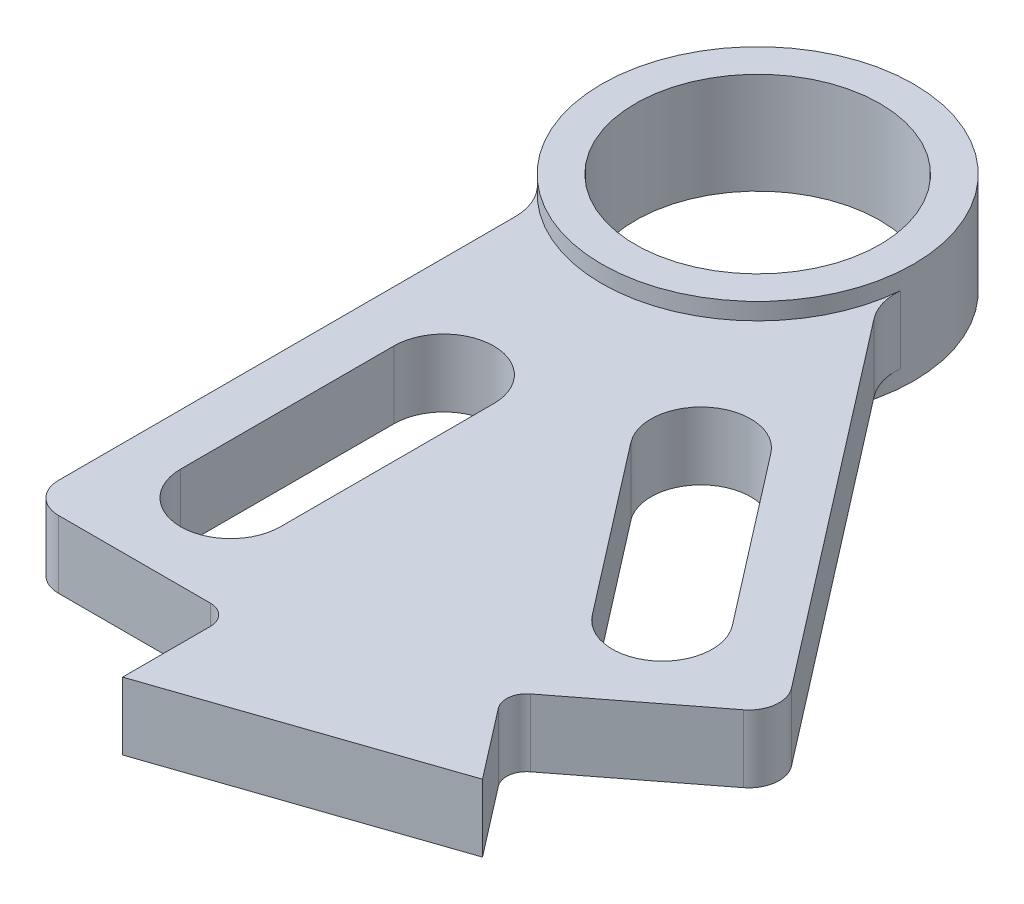
ISO-10303-21;
HEADER;
FILE_DESCRIPTION(('STEP AP214'),'2;1');
FILE_NAME('part.step','',(''),(''),'','','');
FILE_SCHEMA(('AUTOMOTIVE_DESIGN { 1 0 10303 214 1 1 1 1 }'));
ENDSEC;
DATA;
#1=APPLICATION_CONTEXT('core data for automotive mechanical design processes');
#2=APPLICATION_PROTOCOL_DEFINITION('international standard','automotive_design',2000,#1);
#3=PRODUCT_CONTEXT('',#1,'mechanical');
#4=PRODUCT('Part','Part','',(#3));
#5=PRODUCT_RELATED_PRODUCT_CATEGORY('part','',(#4));
#6=PRODUCT_DEFINITION_FORMATION('','',#4);
#7=PRODUCT_DEFINITION_CONTEXT('part definition',#1,'design');
#8=PRODUCT_DEFINITION('design','',#6,#7);
#9=PRODUCT_DEFINITION_SHAPE('','',#8);
#10=(LENGTH_UNIT() NAMED_UNIT(*) SI_UNIT(.MILLI.,.METRE.));
#11=(NAMED_UNIT(*) PLANE_ANGLE_UNIT() SI_UNIT($,.RADIAN.));
#12=(NAMED_UNIT(*) SI_UNIT($,.STERADIAN.) SOLID_ANGLE_UNIT());
#13=UNCERTAINTY_MEASURE_WITH_UNIT(LENGTH_MEASURE(1.E-05),#10,'distance_accuracy_value','');
#14=(GEOMETRIC_REPRESENTATION_CONTEXT(3) GLOBAL_UNCERTAINTY_ASSIGNED_CONTEXT((#13)) GLOBAL_UNIT_ASSIGNED_CONTEXT((#10,
#11,#12)) REPRESENTATION_CONTEXT('',''));
#15=CARTESIAN_POINT('',(0.,0.,0.));
#16=DIRECTION('',(0.,0.,1.));
#17=DIRECTION('',(1.,0.,0.));
#18=AXIS2_PLACEMENT_3D('',#15,#16,#17);
#19=CARTESIAN_POINT('',(0.,4.7625,0.));
#20=DIRECTION('',(0.,-1.,0.));
#21=DIRECTION('',(0.,0.,-1.));
#22=AXIS2_PLACEMENT_3D('',#19,#20,#21);
#23=CYLINDRICAL_SURFACE('',#22,11.5062);
#24=CARTESIAN_POINT('',(0.,4.7625,0.));
#25=DIRECTION('',(0.,1.,0.));
#26=DIRECTION('',(0.,0.,1.));
#27=AXIS2_PLACEMENT_3D('',#24,#25,#26);
#28=CIRCLE('',#27,11.5062);
#29=CARTESIAN_POINT('',(0.,4.7625,-11.5062));
#30=VERTEX_POINT('',#29);
#31=EDGE_CURVE('E309',#30,#30,#28,.T.);
#32=CARTESIAN_POINT('',(0.,-4.7625,0.));
#33=DIRECTION('',(0.,1.,0.));
#34=DIRECTION('',(0.,0.,1.));
#35=AXIS2_PLACEMENT_3D('',#32,#33,#34);
#36=CIRCLE('',#35,11.5062);
#37=CARTESIAN_POINT('',(0.,-4.7625,-11.5062));
#38=VERTEX_POINT('',#37);
#39=EDGE_CURVE('E300',#38,#38,#36,.T.);
#40=CARTESIAN_POINT('',(0.,4.7625,-11.5062));
#41=CARTESIAN_POINT('',(0.,4.66328125,-11.5062));
#42=CARTESIAN_POINT('',(0.,4.5640625,-11.5062));
#43=CARTESIAN_POINT('',(0.,4.365625,-11.5062));
#44=CARTESIAN_POINT('',(0.,4.26640625,-11.5062));
#45=CARTESIAN_POINT('',(0.,4.06796875,-11.5062));
#46=CARTESIAN_POINT('',(0.,3.96875,-11.5062));
#47=CARTESIAN_POINT('',(0.,3.7703125,-11.5062));
#48=CARTESIAN_POINT('',(0.,3.67109375,-11.5062));
#49=CARTESIAN_POINT('',(0.,3.47265625,-11.5062));
#50=CARTESIAN_POINT('',(0.,3.3734375,-11.5062));
#51=CARTESIAN_POINT('',(0.,3.175,-11.5062));
#52=CARTESIAN_POINT('',(0.,3.07578125,-11.5062));
#53=CARTESIAN_POINT('',(0.,2.87734375,-11.5062));
#54=CARTESIAN_POINT('',(0.,2.778125,-11.5062));
#55=CARTESIAN_POINT('',(0.,2.5796875,-11.5062));
#56=CARTESIAN_POINT('',(0.,2.48046875,-11.5062));
#57=CARTESIAN_POINT('',(0.,2.28203125,-11.5062));
#58=CARTESIAN_POINT('',(0.,2.1828125,-11.5062));
#59=CARTESIAN_POINT('',(0.,1.984375,-11.5062));
#60=CARTESIAN_POINT('',(0.,1.88515625,-11.5062));
#61=CARTESIAN_POINT('',(0.,1.68671875,-11.5062));
#62=CARTESIAN_POINT('',(0.,1.5875,-11.5062));
#63=CARTESIAN_POINT('',(0.,1.3890625,-11.5062));
#64=CARTESIAN_POINT('',(0.,1.28984375,-11.5062));
#65=CARTESIAN_POINT('',(0.,1.09140625,-11.5062));
#66=CARTESIAN_POINT('',(0.,0.992187499999999,-11.5062));
#67=CARTESIAN_POINT('',(0.,0.79375,-11.5062));
#68=CARTESIAN_POINT('',(0.,0.69453125,-11.5062));
#69=CARTESIAN_POINT('',(0.,0.49609375,-11.5062));
#70=CARTESIAN_POINT('',(0.,0.396875,-11.5062));
#71=CARTESIAN_POINT('',(0.,0.1984375,-11.5062));
#72=CARTESIAN_POINT('',(0.,0.0992187500000001,-11.5062));
#73=CARTESIAN_POINT('',(0.,-0.0992187500000001,-11.5062));
#74=CARTESIAN_POINT('',(0.,-0.1984375,-11.5062));
#75=CARTESIAN_POINT('',(0.,-0.396875,-11.5062));
#76=CARTESIAN_POINT('',(0.,-0.49609375,-11.5062));
#77=CARTESIAN_POINT('',(0.,-0.69453125,-11.5062));
#78=CARTESIAN_POINT('',(0.,-0.793750000000001,-11.5062));
#79=CARTESIAN_POINT('',(0.,-0.992187500000001,-11.5062));
#80=CARTESIAN_POINT('',(0.,-1.09140625,-11.5062));
#81=CARTESIAN_POINT('',(0.,-1.28984375,-11.5062));
#82=CARTESIAN_POINT('',(0.,-1.3890625,-11.5062));
#83=CARTESIAN_POINT('',(0.,-1.5875,-11.5062));
#84=CARTESIAN_POINT('',(0.,-1.68671875,-11.5062));
#85=CARTESIAN_POINT('',(0.,-1.88515625,-11.5062));
#86=CARTESIAN_POINT('',(0.,-1.984375,-11.5062));
#87=CARTESIAN_POINT('',(0.,-2.1828125,-11.5062));
#88=CARTESIAN_POINT('',(0.,-2.28203125,-11.5062));
#89=CARTESIAN_POINT('',(0.,-2.48046875,-11.5062));
#90=CARTESIAN_POINT('',(0.,-2.5796875,-11.5062));
#91=CARTESIAN_POINT('',(0.,-2.778125,-11.5062));
#92=CARTESIAN_POINT('',(0.,-2.87734375,-11.5062));
#93=CARTESIAN_POINT('',(0.,-3.07578125,-11.5062));
#94=CARTESIAN_POINT('',(0.,-3.175,-11.5062));
#95=CARTESIAN_POINT('',(0.,-3.3734375,-11.5062));
#96=CARTESIAN_POINT('',(0.,-3.47265625,-11.5062));
#97=CARTESIAN_POINT('',(0.,-3.67109375,-11.5062));
#98=CARTESIAN_POINT('',(0.,-3.7703125,-11.5062));
#99=CARTESIAN_POINT('',(0.,-3.96875,-11.5062));
#100=CARTESIAN_POINT('',(0.,-4.06796875,-11.5062));
#101=CARTESIAN_POINT('',(0.,-4.26640625,-11.5062));
#102=CARTESIAN_POINT('',(0.,-4.365625,-11.5062));
#103=CARTESIAN_POINT('',(0.,-4.5640625,-11.5062));
#104=CARTESIAN_POINT('',(0.,-4.66328125,-11.5062));
#105=CARTESIAN_POINT('',(0.,-4.7625,-11.5062));
#106=B_SPLINE_CURVE_WITH_KNOTS('',3,(#40,#41,#42,#43,#44,#45,#46,#47,#48,#49,#50,#51,#52,#53,
#54,#55,#56,#57,#58,#59,#60,#61,#62,#63,#64,#65,#66,#67,#68,#69,#70,#71,#72,#73,#74,#75,#76,#77,
#78,#79,#80,#81,#82,#83,#84,#85,#86,#87,#88,#89,#90,#91,#92,#93,#94,#95,#96,#97,#98,#99,#100,
#101,#102,#103,#104,#105),.UNSPECIFIED.,.F.,.F.,(4,2,2,2,2,2,2,2,2,2,2,2,2,2,2,2,2,2,2,2,2,2,2,
2,2,2,2,2,2,2,2,2,4),(0.,0.29765625,0.5953125,0.892968750000001,1.190625,1.48828125,1.7859375,
2.08359375,2.38125,2.67890625,2.9765625,3.27421875,3.571875,3.86953125,4.1671875,4.46484375,
4.7625,5.06015625,5.3578125,5.65546875,5.953125,6.25078125,6.5484375,6.84609375,7.14375,
7.44140625,7.7390625,8.03671875,8.334375,8.63203125,8.9296875,9.22734375,9.525),.UNSPECIFIED.);
#107=EDGE_CURVE('BSEAM45',#30,#38,#106,.T.);
#108=ORIENTED_EDGE('',*,*,#31,.T.);
#109=ORIENTED_EDGE('',*,*,#39,.F.);
#110=ORIENTED_EDGE('',*,*,#107,.T.);
#111=ORIENTED_EDGE('',*,*,#107,.F.);
#112=EDGE_LOOP('',(#108,#110,#109,#111));
#113=FACE_BOUND('',#112,.T.);
#114=ADVANCED_FACE('F45',(#113),#23,.F.);
#115=CARTESIAN_POINT('',(0.,4.7625,0.));
#116=DIRECTION('',(0.,-1.,0.));
#117=DIRECTION('',(0.,0.,-1.));
#118=AXIS2_PLACEMENT_3D('',#115,#116,#117);
#119=CYLINDRICAL_SURFACE('',#118,14.6812);
#120=DIRECTION('',(0.,-1.,0.));
#121=VECTOR('',#120,1.);
#122=CARTESIAN_POINT('',(14.6318760665032,4.7625,1.20242929708544));
#123=LINE('',#122,#121);
#124=CARTESIAN_POINT('',(14.6318760665032,3.175,1.20242929708544));
#125=VERTEX_POINT('',#124);
#126=CARTESIAN_POINT('',(14.6318760665032,-3.175,1.20242929708544));
#127=VERTEX_POINT('',#126);
#128=EDGE_CURVE('E323',#125,#127,#123,.T.);
#129=ORIENTED_EDGE('',*,*,#128,.T.);
#130=CARTESIAN_POINT('',(0.,-3.175,0.));
#131=DIRECTION('',(0.,1.,0.));
#132=DIRECTION('',(0.,0.,1.));
#133=AXIS2_PLACEMENT_3D('',#130,#131,#132);
#134=CIRCLE('',#133,14.6812);
#135=CARTESIAN_POINT('',(-10.850501285347,-3.175,9.88960339430667));
#136=VERTEX_POINT('',#135);
#137=EDGE_CURVE('E269',#136,#127,#134,.T.);
#138=ORIENTED_EDGE('',*,*,#137,.F.);
#139=DIRECTION('',(0.,-1.,0.));
#140=VECTOR('',#139,1.);
#141=CARTESIAN_POINT('',(-10.850501285347,4.7625,9.88960339430667));
#142=LINE('',#141,#140);
#143=CARTESIAN_POINT('',(-10.850501285347,3.175,9.88960339430667));
#144=VERTEX_POINT('',#143);
#145=EDGE_CURVE('E316',#136,#144,#142,.F.);
#146=ORIENTED_EDGE('',*,*,#145,.T.);
#147=CARTESIAN_POINT('',(0.,3.175,0.));
#148=DIRECTION('',(0.,1.,0.));
#149=DIRECTION('',(0.,0.,1.));
#150=AXIS2_PLACEMENT_3D('',#147,#148,#149);
#151=CIRCLE('',#150,14.6812);
#152=EDGE_CURVE('E230',#144,#125,#151,.T.);
#153=ORIENTED_EDGE('',*,*,#152,.T.);
#154=EDGE_LOOP('',(#129,#138,#146,#153));
#155=FACE_BOUND('',#154,.T.);
#156=CARTESIAN_POINT('',(0.,4.7625,0.));
#157=DIRECTION('',(0.,1.,0.));
#158=DIRECTION('',(0.,0.,1.));
#159=AXIS2_PLACEMENT_3D('',#156,#157,#158);
#160=CIRCLE('',#159,14.6812);
#161=CARTESIAN_POINT('',(0.,4.7625,14.6812));
#162=VERTEX_POINT('',#161);
#163=EDGE_CURVE('E312',#162,#162,#160,.T.);
#164=ORIENTED_EDGE('',*,*,#163,.F.);
#165=EDGE_LOOP('',(#164));
#166=FACE_BOUND('',#165,.T.);
#167=CARTESIAN_POINT('',(0.,-4.7625,0.));
#168=DIRECTION('',(0.,1.,0.));
#169=DIRECTION('',(0.,0.,1.));
#170=AXIS2_PLACEMENT_3D('',#167,#168,#169);
#171=CIRCLE('',#170,14.6812);
#172=CARTESIAN_POINT('',(0.,-4.7625,14.6812));
#173=VERTEX_POINT('',#172);
#174=EDGE_CURVE('E313',#173,#173,#171,.T.);
#175=ORIENTED_EDGE('',*,*,#174,.T.);
#176=EDGE_LOOP('',(#175));
#177=FACE_BOUND('',#176,.T.);
#178=ADVANCED_FACE('F428',(#155,#166,#177),#119,.T.);
#179=CARTESIAN_POINT('',(0.,4.7625,0.));
#180=DIRECTION('',(0.,1.,0.));
#181=DIRECTION('',(0.,0.,1.));
#182=AXIS2_PLACEMENT_3D('',#179,#180,#181);
#183=PLANE('',#182);
#184=ORIENTED_EDGE('',*,*,#31,.F.);
#185=EDGE_LOOP('',(#184));
#186=FACE_BOUND('',#185,.T.);
#187=ORIENTED_EDGE('',*,*,#163,.T.);
#188=EDGE_LOOP('',(#187));
#189=FACE_BOUND('',#188,.T.);
#190=ADVANCED_FACE('F447',(#186,#189),#183,.T.);
#191=CARTESIAN_POINT('',(0.,-4.7625,0.));
#192=DIRECTION('',(0.,1.,0.));
#193=DIRECTION('',(0.,0.,1.));
#194=AXIS2_PLACEMENT_3D('',#191,#192,#193);
#195=PLANE('',#194);
#196=ORIENTED_EDGE('',*,*,#39,.T.);
#197=EDGE_LOOP('',(#196));
#198=FACE_BOUND('',#197,.T.);
#199=ORIENTED_EDGE('',*,*,#174,.F.);
#200=EDGE_LOOP('',(#199));
#201=FACE_BOUND('',#200,.T.);
#202=ADVANCED_FACE('F628',(#198,#201),#195,.F.);
#203=CARTESIAN_POINT('',(0.,3.175,29.5402));
#204=DIRECTION('',(0.,-1.,0.));
#205=DIRECTION('',(0.,0.,-1.));
#206=AXIS2_PLACEMENT_3D('',#203,#204,#205);
#207=CYLINDRICAL_SURFACE('',#206,4.699);
#208=CARTESIAN_POINT('',(0.,-3.175,29.5402));
#209=DIRECTION('',(0.,1.,0.));
#210=DIRECTION('',(0.,0.,1.));
#211=AXIS2_PLACEMENT_3D('',#208,#209,#210);
#212=CIRCLE('',#211,4.699);
#213=CARTESIAN_POINT('',(4.699,-3.175,29.5402));
#214=VERTEX_POINT('',#213);
#215=CARTESIAN_POINT('',(-4.699,-3.175,29.5402));
#216=VERTEX_POINT('',#215);
#217=EDGE_CURVE('E280',#214,#216,#212,.T.);
#218=ORIENTED_EDGE('',*,*,#217,.F.);
#219=DIRECTION('',(0.,-1.,0.));
#220=VECTOR('',#219,1.);
#221=CARTESIAN_POINT('',(4.699,3.175,29.5402));
#222=LINE('',#221,#220);
#223=CARTESIAN_POINT('',(4.699,3.175,29.5402));
#224=VERTEX_POINT('',#223);
#225=EDGE_CURVE('E298',#224,#214,#222,.T.);
#226=ORIENTED_EDGE('',*,*,#225,.F.);
#227=CARTESIAN_POINT('',(0.,3.175,29.5402));
#228=DIRECTION('',(0.,1.,0.));
#229=DIRECTION('',(0.,0.,1.));
#230=AXIS2_PLACEMENT_3D('',#227,#228,#229);
#231=CIRCLE('',#230,4.699);
#232=CARTESIAN_POINT('',(-4.699,3.175,29.5402));
#233=VERTEX_POINT('',#232);
#234=EDGE_CURVE('E241',#224,#233,#231,.T.);
#235=ORIENTED_EDGE('',*,*,#234,.T.);
#236=DIRECTION('',(0.,-1.,0.));
#237=VECTOR('',#236,1.);
#238=CARTESIAN_POINT('',(-4.699,3.175,29.5402));
#239=LINE('',#238,#237);
#240=EDGE_CURVE('E291',#233,#216,#239,.T.);
#241=ORIENTED_EDGE('',*,*,#240,.T.);
#242=EDGE_LOOP('',(#218,#226,#235,#241));
#243=FACE_BOUND('',#242,.T.);
#244=ADVANCED_FACE('F619',(#243),#207,.F.);
#245=CARTESIAN_POINT('',(4.699,3.175,0.));
#246=DIRECTION('',(-1.,0.,0.));
#247=DIRECTION('',(0.,0.,1.));
#248=AXIS2_PLACEMENT_3D('',#245,#246,#247);
#249=PLANE('',#248);
#250=DIRECTION('',(0.,0.,-1.));
#251=VECTOR('',#250,1.);
#252=CARTESIAN_POINT('',(4.699,-3.175,0.));
#253=LINE('',#252,#251);
#254=CARTESIAN_POINT('',(4.699,-3.175,49.6062));
#255=VERTEX_POINT('',#254);
#256=EDGE_CURVE('E283',#255,#214,#253,.T.);
#257=ORIENTED_EDGE('',*,*,#256,.F.);
#258=DIRECTION('',(0.,-1.,0.));
#259=VECTOR('',#258,1.);
#260=CARTESIAN_POINT('',(4.699,3.175,49.6062));
#261=LINE('',#260,#259);
#262=CARTESIAN_POINT('',(4.699,3.175,49.6062));
#263=VERTEX_POINT('',#262);
#264=EDGE_CURVE('E296',#263,#255,#261,.T.);
#265=ORIENTED_EDGE('',*,*,#264,.F.);
#266=DIRECTION('',(0.,0.,-1.));
#267=VECTOR('',#266,1.);
#268=CARTESIAN_POINT('',(4.699,3.175,0.));
#269=LINE('',#268,#267);
#270=EDGE_CURVE('E244',#263,#224,#269,.T.);
#271=ORIENTED_EDGE('',*,*,#270,.T.);
#272=ORIENTED_EDGE('',*,*,#225,.T.);
#273=EDGE_LOOP('',(#257,#265,#271,#272));
#274=FACE_BOUND('',#273,.T.);
#275=ADVANCED_FACE('F610',(#274),#249,.T.);
#276=CARTESIAN_POINT('',(0.,3.175,49.6062));
#277=DIRECTION('',(0.,-1.,0.));
#278=DIRECTION('',(0.,0.,-1.));
#279=AXIS2_PLACEMENT_3D('',#276,#277,#278);
#280=CYLINDRICAL_SURFACE('',#279,4.699);
#281=CARTESIAN_POINT('',(0.,-3.175,49.6062));
#282=DIRECTION('',(0.,1.,0.));
#283=DIRECTION('',(0.,0.,1.));
#284=AXIS2_PLACEMENT_3D('',#281,#282,#283);
#285=CIRCLE('',#284,4.699);
#286=CARTESIAN_POINT('',(-4.699,-3.175,49.6062));
#287=VERTEX_POINT('',#286);
#288=EDGE_CURVE('E286',#287,#255,#285,.T.);
#289=ORIENTED_EDGE('',*,*,#288,.F.);
#290=DIRECTION('',(0.,-1.,0.));
#291=VECTOR('',#290,1.);
#292=CARTESIAN_POINT('',(-4.699,3.175,49.6062));
#293=LINE('',#292,#291);
#294=CARTESIAN_POINT('',(-4.699,3.175,49.6062));
#295=VERTEX_POINT('',#294);
#296=EDGE_CURVE('E293',#295,#287,#293,.T.);
#297=ORIENTED_EDGE('',*,*,#296,.F.);
#298=CARTESIAN_POINT('',(0.,3.175,49.6062));
#299=DIRECTION('',(0.,1.,0.));
#300=DIRECTION('',(0.,0.,1.));
#301=AXIS2_PLACEMENT_3D('',#298,#299,#300);
#302=CIRCLE('',#301,4.699);
#303=EDGE_CURVE('E247',#295,#263,#302,.T.);
#304=ORIENTED_EDGE('',*,*,#303,.T.);
#305=ORIENTED_EDGE('',*,*,#264,.T.);
#306=EDGE_LOOP('',(#289,#297,#304,#305));
#307=FACE_BOUND('',#306,.T.);
#308=ADVANCED_FACE('F602',(#307),#280,.F.);
#309=CARTESIAN_POINT('',(-7.54154326700636,3.175,5.81813975011595));
#310=DIRECTION('',(0.79176307265155,0.,-0.610828320222119));
#311=DIRECTION('',(-0.610828320222119,0.,-0.79176307265155));
#312=AXIS2_PLACEMENT_3D('',#309,#310,#311);
#313=PLANE('',#312);
#314=DIRECTION('',(0.610828320222119,0.,0.79176307265155));
#315=VECTOR('',#314,1.);
#316=CARTESIAN_POINT('',(-7.54154326700636,-3.175,5.81813975011595));
#317=LINE('',#316,#315);
#318=CARTESIAN_POINT('',(29.7410962517352,-3.175,54.1443490050908));
#319=VERTEX_POINT('',#318);
#320=CARTESIAN_POINT('',(34.7834840351685,-3.175,60.680353169829));
#321=VERTEX_POINT('',#320);
#322=EDGE_CURVE('E262',#319,#321,#317,.T.);
#323=ORIENTED_EDGE('',*,*,#322,.F.);
#324=DIRECTION('',(0.,-1.,0.));
#325=VECTOR('',#324,1.);
#326=CARTESIAN_POINT('',(29.7410962517352,3.175,54.1443490050908));
#327=LINE('',#326,#325);
#328=CARTESIAN_POINT('',(29.7410962517352,3.175,54.1443490050908));
#329=VERTEX_POINT('',#328);
#330=EDGE_CURVE('E347',#319,#329,#327,.F.);
#331=ORIENTED_EDGE('',*,*,#330,.T.);
#332=DIRECTION('',(0.610828320222119,0.,0.79176307265155));
#333=VECTOR('',#332,1.);
#334=CARTESIAN_POINT('',(-7.54154326700636,3.175,5.81813975011595));
#335=LINE('',#334,#333);
#336=CARTESIAN_POINT('',(34.7834840351685,3.175,60.680353169829));
#337=VERTEX_POINT('',#336);
#338=EDGE_CURVE('E223',#329,#337,#335,.T.);
#339=ORIENTED_EDGE('',*,*,#338,.T.);
#340=DIRECTION('',(0.,-1.,0.));
#341=VECTOR('',#340,1.);
#342=CARTESIAN_POINT('',(34.7834840351685,3.175,60.680353169829));
#343=LINE('',#342,#341);
#344=EDGE_CURVE('E203',#337,#321,#343,.T.);
#345=ORIENTED_EDGE('',*,*,#344,.T.);
#346=EDGE_LOOP('',(#323,#331,#339,#345));
#347=FACE_BOUND('',#346,.T.);
#348=ADVANCED_FACE('F472',(#347),#313,.T.);
#349=CARTESIAN_POINT('',(36.1190115687184,3.175,46.8179006015736));
#350=DIRECTION('',(-0.610828320222119,0.,-0.791763072651551));
#351=DIRECTION('',(-0.791763072651551,0.,0.610828320222119));
#352=AXIS2_PLACEMENT_3D('',#349,#350,#351);
#353=PLANE('',#352);
#354=DIRECTION('',(0.791763072651551,0.,-0.610828320222119));
#355=VECTOR('',#354,1.);
#356=CARTESIAN_POINT('',(36.1190115687184,-3.175,46.8179006015736));
#357=LINE('',#356,#355);
#358=CARTESIAN_POINT('',(30.0857769551132,-3.175,51.4724124016664));
#359=VERTEX_POINT('',#358);
#360=CARTESIAN_POINT('',(41.3980918556223,-3.175,42.7452027764929));
#361=VERTEX_POINT('',#360);
#362=EDGE_CURVE('E264',#359,#361,#357,.T.);
#363=ORIENTED_EDGE('',*,*,#362,.T.);
#364=DIRECTION('',(0.,-1.,0.));
#365=VECTOR('',#364,1.);
#366=CARTESIAN_POINT('',(41.3980918556223,3.175,42.7452027764929));
#367=LINE('',#366,#365);
#368=CARTESIAN_POINT('',(41.3980918556223,3.175,42.7452027764929));
#369=VERTEX_POINT('',#368);
#370=EDGE_CURVE('E371',#361,#369,#367,.F.);
#371=ORIENTED_EDGE('',*,*,#370,.T.);
#372=DIRECTION('',(0.791763072651551,0.,-0.610828320222119));
#373=VECTOR('',#372,1.);
#374=CARTESIAN_POINT('',(36.1190115687184,3.175,46.8179006015736));
#375=LINE('',#374,#373);
#376=CARTESIAN_POINT('',(30.0857769551132,3.175,51.4724124016664));
#377=VERTEX_POINT('',#376);
#378=EDGE_CURVE('E225',#377,#369,#375,.T.);
#379=ORIENTED_EDGE('',*,*,#378,.F.);
#380=DIRECTION('',(0.,-1.,0.));
#381=VECTOR('',#380,1.);
#382=CARTESIAN_POINT('',(30.0857769551132,3.175,51.4724124016664));
#383=LINE('',#382,#381);
#384=EDGE_CURVE('E344',#377,#359,#383,.T.);
#385=ORIENTED_EDGE('',*,*,#384,.T.);
#386=EDGE_LOOP('',(#363,#371,#379,#385));
#387=FACE_BOUND('',#386,.T.);
#388=ADVANCED_FACE('F411',(#387),#353,.F.);
#389=CARTESIAN_POINT('',(7.54154326700568,3.175,-5.81813975011543));
#390=DIRECTION('',(-0.79176307265155,0.,0.610828320222119));
#391=DIRECTION('',(0.610828320222119,0.,0.79176307265155));
#392=AXIS2_PLACEMENT_3D('',#389,#390,#391);
#393=PLANE('',#392);
#394=DIRECTION('',(-0.610828320222119,0.,-0.791763072651551));
#395=VECTOR('',#394,1.);
#396=CARTESIAN_POINT('',(7.54154326700568,3.175,-5.81813975011543));
#397=LINE('',#396,#395);
#398=CARTESIAN_POINT('',(41.9151129106894,3.175,38.7372978713564));
#399=VERTEX_POINT('',#398);
#400=CARTESIAN_POINT('',(15.6726525524172,3.175,4.72150266453541));
#401=VERTEX_POINT('',#400);
#402=EDGE_CURVE('E228',#399,#401,#397,.T.);
#403=ORIENTED_EDGE('',*,*,#402,.F.);
#404=DIRECTION('',(0.,-1.,0.));
#405=VECTOR('',#404,1.);
#406=CARTESIAN_POINT('',(41.9151129106894,3.175,38.7372978713564));
#407=LINE('',#406,#405);
#408=CARTESIAN_POINT('',(41.9151129106894,-3.175,38.7372978713564));
#409=VERTEX_POINT('',#408);
#410=EDGE_CURVE('E364',#399,#409,#407,.T.);
#411=ORIENTED_EDGE('',*,*,#410,.T.);
#412=DIRECTION('',(-0.610828320222119,0.,-0.791763072651551));
#413=VECTOR('',#412,1.);
#414=CARTESIAN_POINT('',(7.54154326700568,-3.175,-5.81813975011543));
#415=LINE('',#414,#413);
#416=CARTESIAN_POINT('',(15.6726525524172,-3.175,4.72150266453541));
#417=VERTEX_POINT('',#416);
#418=EDGE_CURVE('E267',#409,#417,#415,.T.);
#419=ORIENTED_EDGE('',*,*,#418,.T.);
#420=DIRECTION('',(0.,1.,0.));
#421=VECTOR('',#420,1.);
#422=CARTESIAN_POINT('',(15.6726525524172,3.175,4.72150266453541));
#423=LINE('',#422,#421);
#424=EDGE_CURVE('E326',#417,#401,#423,.T.);
#425=ORIENTED_EDGE('',*,*,#424,.T.);
#426=EDGE_LOOP('',(#403,#411,#419,#425));
#427=FACE_BOUND('',#426,.T.);
#428=ADVANCED_FACE('F420',(#427),#393,.F.);
#429=CARTESIAN_POINT('',(-9.525,3.175,0.));
#430=DIRECTION('',(-1.,0.,0.));
#431=DIRECTION('',(0.,0.,1.));
#432=AXIS2_PLACEMENT_3D('',#429,#430,#431);
#433=PLANE('',#432);
#434=DIRECTION('',(0.,0.,-1.));
#435=VECTOR('',#434,1.);
#436=CARTESIAN_POINT('',(-9.525,-3.175,0.));
#437=LINE('',#436,#435);
#438=CARTESIAN_POINT('',(-9.525,-3.175,56.2737));
#439=VERTEX_POINT('',#438);
#440=CARTESIAN_POINT('',(-9.525,-3.175,13.3116114892225));
#441=VERTEX_POINT('',#440);
#442=EDGE_CURVE('E271',#439,#441,#437,.T.);
#443=ORIENTED_EDGE('',*,*,#442,.F.);
#444=DIRECTION('',(0.,-1.,0.));
#445=VECTOR('',#444,1.);
#446=CARTESIAN_POINT('',(-9.525,3.175,56.2737));
#447=LINE('',#446,#445);
#448=CARTESIAN_POINT('',(-9.525,3.175,56.2737));
#449=VERTEX_POINT('',#448);
#450=EDGE_CURVE('E11',#439,#449,#447,.F.);
#451=ORIENTED_EDGE('',*,*,#450,.T.);
#452=DIRECTION('',(0.,0.,-1.));
#453=VECTOR('',#452,1.);
#454=CARTESIAN_POINT('',(-9.525,3.175,0.));
#455=LINE('',#454,#453);
#456=CARTESIAN_POINT('',(-9.525,3.175,13.3116114892225));
#457=VERTEX_POINT('',#456);
#458=EDGE_CURVE('E232',#449,#457,#455,.T.);
#459=ORIENTED_EDGE('',*,*,#458,.T.);
#460=DIRECTION('',(0.,-1.,0.));
#461=VECTOR('',#460,1.);
#462=CARTESIAN_POINT('',(-9.525,3.175,13.3116114892225));
#463=LINE('',#462,#461);
#464=EDGE_CURVE('E329',#457,#441,#463,.T.);
#465=ORIENTED_EDGE('',*,*,#464,.T.);
#466=EDGE_LOOP('',(#443,#451,#459,#465));
#467=FACE_BOUND('',#466,.T.);
#468=ADVANCED_FACE('F481',(#467),#433,.T.);
#469=CARTESIAN_POINT('',(0.,3.175,59.1312));
#470=DIRECTION('',(0.,0.,-1.));
#471=DIRECTION('',(-1.,0.,0.));
#472=AXIS2_PLACEMENT_3D('',#469,#470,#471);
#473=PLANE('',#472);
#474=DIRECTION('',(1.,0.,0.));
#475=VECTOR('',#474,1.);
#476=CARTESIAN_POINT('',(0.,3.175,59.1312));
#477=LINE('',#476,#475);
#478=CARTESIAN_POINT('',(-6.6675,3.175,59.1312));
#479=VERTEX_POINT('',#478);
#480=CARTESIAN_POINT('',(7.62,3.175,59.1312));
#481=VERTEX_POINT('',#480);
#482=EDGE_CURVE('E234',#479,#481,#477,.T.);
#483=ORIENTED_EDGE('',*,*,#482,.F.);
#484=DIRECTION('',(0.,-1.,0.));
#485=VECTOR('',#484,1.);
#486=CARTESIAN_POINT('',(-6.6675,-3.175,59.1312));
#487=LINE('',#486,#485);
#488=CARTESIAN_POINT('',(-6.6675,-3.175,59.1312));
#489=VERTEX_POINT('',#488);
#490=EDGE_CURVE('E53',#479,#489,#487,.T.);
#491=ORIENTED_EDGE('',*,*,#490,.T.);
#492=DIRECTION('',(1.,0.,0.));
#493=VECTOR('',#492,1.);
#494=CARTESIAN_POINT('',(0.,-3.175,59.1312));
#495=LINE('',#494,#493);
#496=CARTESIAN_POINT('',(7.62,-3.175,59.1312));
#497=VERTEX_POINT('',#496);
#498=EDGE_CURVE('E273',#489,#497,#495,.T.);
#499=ORIENTED_EDGE('',*,*,#498,.T.);
#500=DIRECTION('',(0.,-1.,0.));
#501=VECTOR('',#500,1.);
#502=CARTESIAN_POINT('',(7.62,3.175,59.1312));
#503=LINE('',#502,#501);
#504=EDGE_CURVE('E352',#497,#481,#503,.F.);
#505=ORIENTED_EDGE('',*,*,#504,.T.);
#506=EDGE_LOOP('',(#483,#491,#499,#505));
#507=FACE_BOUND('',#506,.T.);
#508=ADVANCED_FACE('F379',(#507),#473,.F.);
#509=CARTESIAN_POINT('',(9.525,3.175,0.));
#510=DIRECTION('',(1.,0.,0.));
#511=DIRECTION('',(0.,0.,-1.));
#512=AXIS2_PLACEMENT_3D('',#509,#510,#511);
#513=PLANE('',#512);
#514=DIRECTION('',(0.,0.,1.));
#515=VECTOR('',#514,1.);
#516=CARTESIAN_POINT('',(9.525,3.175,0.));
#517=LINE('',#516,#515);
#518=CARTESIAN_POINT('',(9.525,3.175,61.0362));
#519=VERTEX_POINT('',#518);
#520=CARTESIAN_POINT('',(9.525,3.175,69.2912));
#521=VERTEX_POINT('',#520);
#522=EDGE_CURVE('E236',#519,#521,#517,.T.);
#523=ORIENTED_EDGE('',*,*,#522,.F.);
#524=DIRECTION('',(0.,-1.,0.));
#525=VECTOR('',#524,1.);
#526=CARTESIAN_POINT('',(9.525,-3.175,61.0362));
#527=LINE('',#526,#525);
#528=CARTESIAN_POINT('',(9.525,-3.175,61.0362));
#529=VERTEX_POINT('',#528);
#530=EDGE_CURVE('E349',#519,#529,#527,.T.);
#531=ORIENTED_EDGE('',*,*,#530,.T.);
#532=DIRECTION('',(0.,0.,1.));
#533=VECTOR('',#532,1.);
#534=CARTESIAN_POINT('',(9.525,-3.175,0.));
#535=LINE('',#534,#533);
#536=CARTESIAN_POINT('',(9.525,-3.175,69.2912));
#537=VERTEX_POINT('',#536);
#538=EDGE_CURVE('E275',#529,#537,#535,.T.);
#539=ORIENTED_EDGE('',*,*,#538,.T.);
#540=DIRECTION('',(0.,-1.,0.));
#541=VECTOR('',#540,1.);
#542=CARTESIAN_POINT('',(9.525,3.175,69.2912));
#543=LINE('',#542,#541);
#544=EDGE_CURVE('E294',#521,#537,#543,.T.);
#545=ORIENTED_EDGE('',*,*,#544,.F.);
#546=EDGE_LOOP('',(#523,#531,#539,#545));
#547=FACE_BOUND('',#546,.T.);
#548=ADVANCED_FACE('F397',(#547),#513,.F.);
#549=CARTESIAN_POINT('',(30.3008718186024,3.175,39.2763573345679));
#550=DIRECTION('',(0.,-1.,0.));
#551=DIRECTION('',(0.,0.,-1.));
#552=AXIS2_PLACEMENT_3D('',#549,#550,#551);
#553=CYLINDRICAL_SURFACE('',#552,4.69899999999999);
#554=CARTESIAN_POINT('',(30.3008718186024,-3.175,39.2763573345679));
#555=DIRECTION('',(0.,1.,0.));
#556=DIRECTION('',(0.,0.,1.));
#557=AXIS2_PLACEMENT_3D('',#554,#555,#556);
#558=CIRCLE('',#557,4.69899999999999);
#559=CARTESIAN_POINT('',(26.5803771402128,-3.175,42.1466396112916));
#560=VERTEX_POINT('',#559);
#561=CARTESIAN_POINT('',(34.021366496992,-3.175,36.4060750578441));
#562=VERTEX_POINT('',#561);
#563=EDGE_CURVE('E198',#560,#562,#558,.T.);
#564=ORIENTED_EDGE('',*,*,#563,.F.);
#565=DIRECTION('',(0.,-1.,0.));
#566=VECTOR('',#565,1.);
#567=CARTESIAN_POINT('',(26.5803771402128,3.175,42.1466396112916));
#568=LINE('',#567,#566);
#569=CARTESIAN_POINT('',(26.5803771402128,3.175,42.1466396112916));
#570=VERTEX_POINT('',#569);
#571=EDGE_CURVE('E193',#570,#560,#568,.T.);
#572=ORIENTED_EDGE('',*,*,#571,.F.);
#573=CARTESIAN_POINT('',(30.3008718186024,3.175,39.2763573345679));
#574=DIRECTION('',(0.,1.,0.));
#575=DIRECTION('',(0.,0.,1.));
#576=AXIS2_PLACEMENT_3D('',#573,#574,#575);
#577=CIRCLE('',#576,4.69899999999999);
#578=CARTESIAN_POINT('',(34.021366496992,3.175,36.4060750578441));
#579=VERTEX_POINT('',#578);
#580=EDGE_CURVE('E196',#570,#579,#577,.T.);
#581=ORIENTED_EDGE('',*,*,#580,.T.);
#582=DIRECTION('',(0.,-1.,0.));
#583=VECTOR('',#582,1.);
#584=CARTESIAN_POINT('',(34.021366496992,3.175,36.4060750578441));
#585=LINE('',#584,#583);
#586=EDGE_CURVE('E252',#579,#562,#585,.T.);
#587=ORIENTED_EDGE('',*,*,#586,.T.);
#588=EDGE_LOOP('',(#564,#572,#581,#587));
#589=FACE_BOUND('',#588,.T.);
#590=ADVANCED_FACE('F195',(#589),#553,.F.);
#591=CARTESIAN_POINT('',(-3.72049467838997,3.175,2.870282276724));
#592=DIRECTION('',(0.79176307265155,0.,-0.61082832022212));
#593=DIRECTION('',(-0.61082832022212,0.,-0.79176307265155));
#594=AXIS2_PLACEMENT_3D('',#591,#592,#593);
#595=PLANE('',#594);
#596=DIRECTION('',(0.61082832022212,0.,0.79176307265155));
#597=VECTOR('',#596,1.);
#598=CARTESIAN_POINT('',(-3.72049467838997,-3.175,2.870282276724));
#599=LINE('',#598,#597);
#600=CARTESIAN_POINT('',(14.3234960666357,-3.175,26.2591217954656));
#601=VERTEX_POINT('',#600);
#602=EDGE_CURVE('E254',#601,#560,#599,.T.);
#603=ORIENTED_EDGE('',*,*,#602,.F.);
#604=DIRECTION('',(0.,-1.,0.));
#605=VECTOR('',#604,1.);
#606=CARTESIAN_POINT('',(14.3234960666357,3.175,26.2591217954656));
#607=LINE('',#606,#605);
#608=CARTESIAN_POINT('',(14.3234960666357,3.175,26.2591217954656));
#609=VERTEX_POINT('',#608);
#610=EDGE_CURVE('E204',#609,#601,#607,.T.);
#611=ORIENTED_EDGE('',*,*,#610,.F.);
#612=DIRECTION('',(0.61082832022212,0.,0.79176307265155));
#613=VECTOR('',#612,1.);
#614=CARTESIAN_POINT('',(-3.72049467838997,3.175,2.870282276724));
#615=LINE('',#614,#613);
#616=EDGE_CURVE('E210',#609,#570,#615,.T.);
#617=ORIENTED_EDGE('',*,*,#616,.T.);
#618=ORIENTED_EDGE('',*,*,#571,.T.);
#619=EDGE_LOOP('',(#603,#611,#617,#618));
#620=FACE_BOUND('',#619,.T.);
#621=ADVANCED_FACE('F217',(#620),#595,.T.);
#622=CARTESIAN_POINT('',(18.0439907450253,3.175,23.3888395187419));
#623=DIRECTION('',(0.,-1.,0.));
#624=DIRECTION('',(0.,0.,-1.));
#625=AXIS2_PLACEMENT_3D('',#622,#623,#624);
#626=CYLINDRICAL_SURFACE('',#625,4.699);
#627=CARTESIAN_POINT('',(18.0439907450253,-3.175,23.3888395187419));
#628=DIRECTION('',(0.,1.,0.));
#629=DIRECTION('',(0.,0.,1.));
#630=AXIS2_PLACEMENT_3D('',#627,#628,#629);
#631=CIRCLE('',#630,4.699);
#632=CARTESIAN_POINT('',(21.764485423415,-3.175,20.5185572420181));
#633=VERTEX_POINT('',#632);
#634=EDGE_CURVE('E256',#633,#601,#631,.T.);
#635=ORIENTED_EDGE('',*,*,#634,.F.);
#636=DIRECTION('',(0.,-1.,0.));
#637=VECTOR('',#636,1.);
#638=CARTESIAN_POINT('',(21.764485423415,3.175,20.5185572420181));
#639=LINE('',#638,#637);
#640=CARTESIAN_POINT('',(21.764485423415,3.175,20.5185572420181));
#641=VERTEX_POINT('',#640);
#642=EDGE_CURVE('E306',#641,#633,#639,.T.);
#643=ORIENTED_EDGE('',*,*,#642,.F.);
#644=CARTESIAN_POINT('',(18.0439907450253,3.175,23.3888395187419));
#645=DIRECTION('',(0.,1.,0.));
#646=DIRECTION('',(0.,0.,1.));
#647=AXIS2_PLACEMENT_3D('',#644,#645,#646);
#648=CIRCLE('',#647,4.699);
#649=EDGE_CURVE('E218',#641,#609,#648,.T.);
#650=ORIENTED_EDGE('',*,*,#649,.T.);
#651=ORIENTED_EDGE('',*,*,#610,.T.);
#652=EDGE_LOOP('',(#635,#643,#650,#651));
#653=FACE_BOUND('',#652,.T.);
#654=ADVANCED_FACE('F564',(#653),#626,.F.);
#655=CARTESIAN_POINT('',(22.1542420175843,3.175,64.9857765849145));
#656=DIRECTION('',(-0.322673927788136,0.,-0.946510188178541));
#657=DIRECTION('',(-0.946510188178541,0.,0.322673927788136));
#658=AXIS2_PLACEMENT_3D('',#655,#656,#657);
#659=PLANE('',#658);
#660=DIRECTION('',(0.946510188178541,0.,-0.322673927788136));
#661=VECTOR('',#660,1.);
#662=CARTESIAN_POINT('',(22.1542420175843,-3.175,64.9857765849145));
#663=LINE('',#662,#661);
#664=EDGE_CURVE('E277',#537,#321,#663,.T.);
#665=ORIENTED_EDGE('',*,*,#664,.T.);
#666=ORIENTED_EDGE('',*,*,#344,.F.);
#667=DIRECTION('',(0.946510188178541,0.,-0.322673927788136));
#668=VECTOR('',#667,1.);
#669=CARTESIAN_POINT('',(22.1542420175843,3.175,64.9857765849145));
#670=LINE('',#669,#668);
#671=EDGE_CURVE('E238',#521,#337,#670,.T.);
#672=ORIENTED_EDGE('',*,*,#671,.F.);
#673=ORIENTED_EDGE('',*,*,#544,.T.);
#674=EDGE_LOOP('',(#665,#666,#672,#673));
#675=FACE_BOUND('',#674,.T.);
#676=ADVANCED_FACE('F399',(#675),#659,.F.);
#677=CARTESIAN_POINT('',(3.72049467838933,3.175,-2.8702822767235));
#678=DIRECTION('',(0.791763072651551,0.,-0.610828320222119));
#679=DIRECTION('',(-0.610828320222119,0.,-0.791763072651551));
#680=AXIS2_PLACEMENT_3D('',#677,#678,#679);
#681=PLANE('',#680);
#682=DIRECTION('',(0.610828320222119,0.,0.791763072651551));
#683=VECTOR('',#682,1.);
#684=CARTESIAN_POINT('',(3.72049467838933,-3.175,-2.8702822767235));
#685=LINE('',#684,#683);
#686=EDGE_CURVE('E259',#633,#562,#685,.T.);
#687=ORIENTED_EDGE('',*,*,#686,.T.);
#688=ORIENTED_EDGE('',*,*,#586,.F.);
#689=DIRECTION('',(0.610828320222119,0.,0.791763072651551));
#690=VECTOR('',#689,1.);
#691=CARTESIAN_POINT('',(3.72049467838933,3.175,-2.8702822767235));
#692=LINE('',#691,#690);
#693=EDGE_CURVE('E213',#641,#579,#692,.T.);
#694=ORIENTED_EDGE('',*,*,#693,.F.);
#695=ORIENTED_EDGE('',*,*,#642,.T.);
#696=EDGE_LOOP('',(#687,#688,#694,#695));
#697=FACE_BOUND('',#696,.T.);
#698=ADVANCED_FACE('F547',(#697),#681,.F.);
#699=CARTESIAN_POINT('',(-4.699,3.175,0.));
#700=DIRECTION('',(-1.,0.,0.));
#701=DIRECTION('',(0.,0.,1.));
#702=AXIS2_PLACEMENT_3D('',#699,#700,#701);
#703=PLANE('',#702);
#704=DIRECTION('',(0.,0.,-1.));
#705=VECTOR('',#704,1.);
#706=CARTESIAN_POINT('',(-4.699,-3.175,0.));
#707=LINE('',#706,#705);
#708=EDGE_CURVE('E215',#287,#216,#707,.T.);
#709=ORIENTED_EDGE('',*,*,#708,.T.);
#710=ORIENTED_EDGE('',*,*,#240,.F.);
#711=DIRECTION('',(0.,0.,-1.));
#712=VECTOR('',#711,1.);
#713=CARTESIAN_POINT('',(-4.699,3.175,0.));
#714=LINE('',#713,#712);
#715=EDGE_CURVE('E250',#295,#233,#714,.T.);
#716=ORIENTED_EDGE('',*,*,#715,.F.);
#717=ORIENTED_EDGE('',*,*,#296,.T.);
#718=EDGE_LOOP('',(#709,#710,#716,#717));
#719=FACE_BOUND('',#718,.T.);
#720=ADVANCED_FACE('F504',(#719),#703,.F.);
#721=CARTESIAN_POINT('',(0.,3.175,0.));
#722=DIRECTION('',(0.,1.,0.));
#723=DIRECTION('',(0.,0.,1.));
#724=AXIS2_PLACEMENT_3D('',#721,#722,#723);
#725=PLANE('',#724);
#726=ORIENTED_EDGE('',*,*,#580,.F.);
#727=ORIENTED_EDGE('',*,*,#616,.F.);
#728=ORIENTED_EDGE('',*,*,#649,.F.);
#729=ORIENTED_EDGE('',*,*,#693,.T.);
#730=EDGE_LOOP('',(#726,#727,#728,#729));
#731=FACE_BOUND('',#730,.T.);
#732=ORIENTED_EDGE('',*,*,#378,.T.);
#733=CARTESIAN_POINT('',(39.6526499305876,3.175,40.4827397963911));
#734=DIRECTION('',(0.,1.,0.));
#735=DIRECTION('',(0.,0.,1.));
#736=AXIS2_PLACEMENT_3D('',#733,#734,#735);
#737=CIRCLE('',#736,2.8575);
#738=EDGE_CURVE('E374',#369,#399,#737,.T.);
#739=ORIENTED_EDGE('',*,*,#738,.T.);
#740=ORIENTED_EDGE('',*,*,#402,.T.);
#741=CARTESIAN_POINT('',(19.6948089614871,3.175,1.61849479780704));
#742=DIRECTION('',(0.,1.,0.));
#743=DIRECTION('',(0.,0.,1.));
#744=AXIS2_PLACEMENT_3D('',#741,#742,#743);
#745=CIRCLE('',#744,5.08);
#746=EDGE_CURVE('E335',#401,#125,#745,.F.);
#747=ORIENTED_EDGE('',*,*,#746,.T.);
#748=ORIENTED_EDGE('',*,*,#152,.F.);
#749=CARTESIAN_POINT('',(-14.605,3.175,13.3116114892225));
#750=DIRECTION('',(0.,1.,0.));
#751=DIRECTION('',(0.,0.,1.));
#752=AXIS2_PLACEMENT_3D('',#749,#750,#751);
#753=CIRCLE('',#752,5.08);
#754=EDGE_CURVE('E341',#144,#457,#753,.F.);
#755=ORIENTED_EDGE('',*,*,#754,.T.);
#756=ORIENTED_EDGE('',*,*,#458,.F.);
#757=CARTESIAN_POINT('',(-6.6675,3.175,56.2737));
#758=DIRECTION('',(0.,1.,0.));
#759=DIRECTION('',(0.,0.,1.));
#760=AXIS2_PLACEMENT_3D('',#757,#758,#759);
#761=CIRCLE('',#760,2.8575);
#762=EDGE_CURVE('E60',#449,#479,#761,.T.);
#763=ORIENTED_EDGE('',*,*,#762,.T.);
#764=ORIENTED_EDGE('',*,*,#482,.T.);
#765=CARTESIAN_POINT('',(7.62,3.175,61.0362));
#766=DIRECTION('',(0.,1.,0.));
#767=DIRECTION('',(0.,0.,1.));
#768=AXIS2_PLACEMENT_3D('',#765,#766,#767);
#769=CIRCLE('',#768,1.905);
#770=EDGE_CURVE('E362',#481,#519,#769,.F.);
#771=ORIENTED_EDGE('',*,*,#770,.T.);
#772=ORIENTED_EDGE('',*,*,#522,.T.);
#773=ORIENTED_EDGE('',*,*,#671,.T.);
#774=ORIENTED_EDGE('',*,*,#338,.F.);
#775=CARTESIAN_POINT('',(31.2494049051364,3.175,52.9807210550676));
#776=DIRECTION('',(0.,1.,0.));
#777=DIRECTION('',(0.,0.,1.));
#778=AXIS2_PLACEMENT_3D('',#775,#776,#777);
#779=CIRCLE('',#778,1.905);
#780=EDGE_CURVE('E357',#329,#377,#779,.F.);
#781=ORIENTED_EDGE('',*,*,#780,.T.);
#782=EDGE_LOOP('',(#732,#739,#740,#747,#748,#755,#756,#763,#764,#771,#772,#773,#774,#781));
#783=FACE_BOUND('',#782,.T.);
#784=ORIENTED_EDGE('',*,*,#234,.F.);
#785=ORIENTED_EDGE('',*,*,#270,.F.);
#786=ORIENTED_EDGE('',*,*,#303,.F.);
#787=ORIENTED_EDGE('',*,*,#715,.T.);
#788=EDGE_LOOP('',(#784,#785,#786,#787));
#789=FACE_BOUND('',#788,.T.);
#790=ADVANCED_FACE('F208',(#731,#783,#789),#725,.T.);
#791=CARTESIAN_POINT('',(0.,-3.175,0.));
#792=DIRECTION('',(0.,1.,0.));
#793=DIRECTION('',(0.,0.,1.));
#794=AXIS2_PLACEMENT_3D('',#791,#792,#793);
#795=PLANE('',#794);
#796=ORIENTED_EDGE('',*,*,#563,.T.);
#797=ORIENTED_EDGE('',*,*,#686,.F.);
#798=ORIENTED_EDGE('',*,*,#634,.T.);
#799=ORIENTED_EDGE('',*,*,#602,.T.);
#800=EDGE_LOOP('',(#796,#797,#798,#799));
#801=FACE_BOUND('',#800,.T.);
#802=ORIENTED_EDGE('',*,*,#418,.F.);
#803=CARTESIAN_POINT('',(39.6526499305876,-3.175,40.4827397963911));
#804=DIRECTION('',(0.,1.,0.));
#805=DIRECTION('',(0.,0.,1.));
#806=AXIS2_PLACEMENT_3D('',#803,#804,#805);
#807=CIRCLE('',#806,2.8575);
#808=EDGE_CURVE('E369',#409,#361,#807,.F.);
#809=ORIENTED_EDGE('',*,*,#808,.T.);
#810=ORIENTED_EDGE('',*,*,#362,.F.);
#811=CARTESIAN_POINT('',(31.2494049051364,-3.175,52.9807210550676));
#812=DIRECTION('',(0.,1.,0.));
#813=DIRECTION('',(0.,0.,1.));
#814=AXIS2_PLACEMENT_3D('',#811,#812,#813);
#815=CIRCLE('',#814,1.905);
#816=EDGE_CURVE('E355',#359,#319,#815,.T.);
#817=ORIENTED_EDGE('',*,*,#816,.T.);
#818=ORIENTED_EDGE('',*,*,#322,.T.);
#819=ORIENTED_EDGE('',*,*,#664,.F.);
#820=ORIENTED_EDGE('',*,*,#538,.F.);
#821=CARTESIAN_POINT('',(7.62,-3.175,61.0362));
#822=DIRECTION('',(0.,1.,0.));
#823=DIRECTION('',(0.,0.,1.));
#824=AXIS2_PLACEMENT_3D('',#821,#822,#823);
#825=CIRCLE('',#824,1.905);
#826=EDGE_CURVE('E359',#529,#497,#825,.T.);
#827=ORIENTED_EDGE('',*,*,#826,.T.);
#828=ORIENTED_EDGE('',*,*,#498,.F.);
#829=CARTESIAN_POINT('',(-6.6675,-3.175,56.2737));
#830=DIRECTION('',(0.,1.,0.));
#831=DIRECTION('',(0.,0.,1.));
#832=AXIS2_PLACEMENT_3D('',#829,#830,#831);
#833=CIRCLE('',#832,2.8575);
#834=EDGE_CURVE('E367',#489,#439,#833,.F.);
#835=ORIENTED_EDGE('',*,*,#834,.T.);
#836=ORIENTED_EDGE('',*,*,#442,.T.);
#837=CARTESIAN_POINT('',(-14.605,-3.175,13.3116114892225));
#838=DIRECTION('',(0.,1.,0.));
#839=DIRECTION('',(0.,0.,1.));
#840=AXIS2_PLACEMENT_3D('',#837,#838,#839);
#841=CIRCLE('',#840,5.08);
#842=EDGE_CURVE('E338',#441,#136,#841,.T.);
#843=ORIENTED_EDGE('',*,*,#842,.T.);
#844=ORIENTED_EDGE('',*,*,#137,.T.);
#845=CARTESIAN_POINT('',(19.6948089614871,-3.175,1.61849479780704));
#846=DIRECTION('',(0.,1.,0.));
#847=DIRECTION('',(0.,0.,1.));
#848=AXIS2_PLACEMENT_3D('',#845,#846,#847);
#849=CIRCLE('',#848,5.08);
#850=EDGE_CURVE('E332',#127,#417,#849,.T.);
#851=ORIENTED_EDGE('',*,*,#850,.T.);
#852=EDGE_LOOP('',(#802,#809,#810,#817,#818,#819,#820,#827,#828,#835,#836,#843,#844,#851));
#853=FACE_BOUND('',#852,.T.);
#854=ORIENTED_EDGE('',*,*,#217,.T.);
#855=ORIENTED_EDGE('',*,*,#708,.F.);
#856=ORIENTED_EDGE('',*,*,#288,.T.);
#857=ORIENTED_EDGE('',*,*,#256,.T.);
#858=EDGE_LOOP('',(#854,#855,#856,#857));
#859=FACE_BOUND('',#858,.T.);
#860=ADVANCED_FACE('F383',(#801,#853,#859),#795,.F.);
#861=CARTESIAN_POINT('',(19.6948089614871,4.7625,1.61849479780704));
#862=DIRECTION('',(0.,-1.,0.));
#863=DIRECTION('',(0.,0.,-1.));
#864=AXIS2_PLACEMENT_3D('',#861,#862,#863);
#865=CYLINDRICAL_SURFACE('',#864,5.08);
#866=ORIENTED_EDGE('',*,*,#746,.F.);
#867=ORIENTED_EDGE('',*,*,#424,.F.);
#868=ORIENTED_EDGE('',*,*,#850,.F.);
#869=ORIENTED_EDGE('',*,*,#128,.F.);
#870=EDGE_LOOP('',(#866,#867,#868,#869));
#871=FACE_BOUND('',#870,.T.);
#872=ADVANCED_FACE('F426',(#871),#865,.F.);
#873=CARTESIAN_POINT('',(-14.605,4.7625,13.3116114892225));
#874=DIRECTION('',(0.,-1.,0.));
#875=DIRECTION('',(0.,0.,-1.));
#876=AXIS2_PLACEMENT_3D('',#873,#874,#875);
#877=CYLINDRICAL_SURFACE('',#876,5.08);
#878=ORIENTED_EDGE('',*,*,#754,.F.);
#879=ORIENTED_EDGE('',*,*,#145,.F.);
#880=ORIENTED_EDGE('',*,*,#842,.F.);
#881=ORIENTED_EDGE('',*,*,#464,.F.);
#882=EDGE_LOOP('',(#878,#879,#880,#881));
#883=FACE_BOUND('',#882,.T.);
#884=ADVANCED_FACE('F435',(#883),#877,.F.);
#885=CARTESIAN_POINT('',(31.2494049051364,3.175,52.9807210550676));
#886=DIRECTION('',(0.,-1.,0.));
#887=DIRECTION('',(0.,0.,-1.));
#888=AXIS2_PLACEMENT_3D('',#885,#886,#887);
#889=CYLINDRICAL_SURFACE('',#888,1.905);
#890=ORIENTED_EDGE('',*,*,#780,.F.);
#891=ORIENTED_EDGE('',*,*,#330,.F.);
#892=ORIENTED_EDGE('',*,*,#816,.F.);
#893=ORIENTED_EDGE('',*,*,#384,.F.);
#894=EDGE_LOOP('',(#890,#891,#892,#893));
#895=FACE_BOUND('',#894,.T.);
#896=ADVANCED_FACE('F408',(#895),#889,.F.);
#897=CARTESIAN_POINT('',(7.62,3.175,61.0362));
#898=DIRECTION('',(0.,1.,0.));
#899=DIRECTION('',(0.,0.,1.));
#900=AXIS2_PLACEMENT_3D('',#897,#898,#899);
#901=CYLINDRICAL_SURFACE('',#900,1.905);
#902=ORIENTED_EDGE('',*,*,#770,.F.);
#903=ORIENTED_EDGE('',*,*,#504,.F.);
#904=ORIENTED_EDGE('',*,*,#826,.F.);
#905=ORIENTED_EDGE('',*,*,#530,.F.);
#906=EDGE_LOOP('',(#902,#903,#904,#905));
#907=FACE_BOUND('',#906,.T.);
#908=ADVANCED_FACE('F391',(#907),#901,.F.);
#909=CARTESIAN_POINT('',(39.6526499305876,3.175,40.4827397963911));
#910=DIRECTION('',(0.,-1.,0.));
#911=DIRECTION('',(0.,0.,-1.));
#912=AXIS2_PLACEMENT_3D('',#909,#910,#911);
#913=CYLINDRICAL_SURFACE('',#912,2.8575);
#914=ORIENTED_EDGE('',*,*,#738,.F.);
#915=ORIENTED_EDGE('',*,*,#370,.F.);
#916=ORIENTED_EDGE('',*,*,#808,.F.);
#917=ORIENTED_EDGE('',*,*,#410,.F.);
#918=EDGE_LOOP('',(#914,#915,#916,#917));
#919=FACE_BOUND('',#918,.T.);
#920=ADVANCED_FACE('F417',(#919),#913,.T.);
#921=CARTESIAN_POINT('',(-6.6675,3.175,56.2737));
#922=DIRECTION('',(0.,1.,0.));
#923=DIRECTION('',(0.,0.,1.));
#924=AXIS2_PLACEMENT_3D('',#921,#922,#923);
#925=CYLINDRICAL_SURFACE('',#924,2.8575);
#926=ORIENTED_EDGE('',*,*,#762,.F.);
#927=ORIENTED_EDGE('',*,*,#450,.F.);
#928=ORIENTED_EDGE('',*,*,#834,.F.);
#929=ORIENTED_EDGE('',*,*,#490,.F.);
#930=EDGE_LOOP('',(#926,#927,#928,#929));
#931=FACE_BOUND('',#930,.T.);
#932=ADVANCED_FACE('F47',(#931),#925,.T.);
#933=CLOSED_SHELL('',(#114,#178,#190,#202,#244,#275,#308,#348,#388,#428,#468,#508,#548,#590,
#621,#654,#676,#698,#720,#790,#860,#872,#884,#896,#908,#920,#932));
#934=MANIFOLD_SOLID_BREP('B2',#933);
#935=ADVANCED_BREP_SHAPE_REPRESENTATION('',(#18,#934),#14);
#936=SHAPE_DEFINITION_REPRESENTATION(#9,#935);
ENDSEC;
END-ISO-10303-21;
